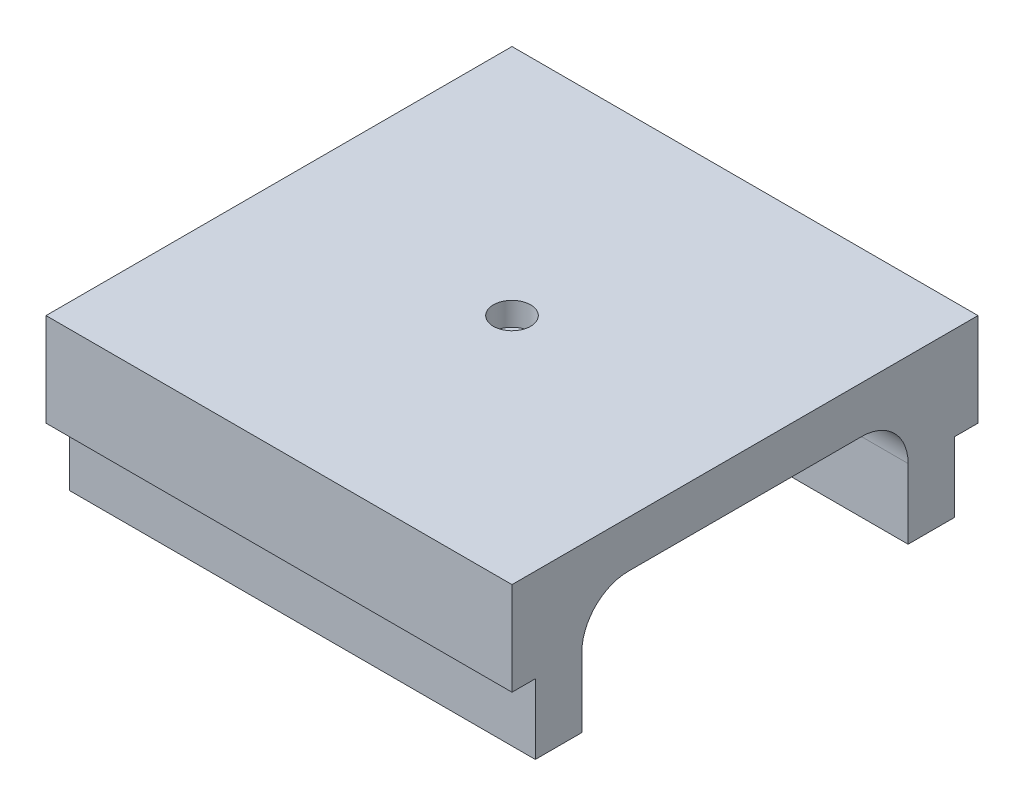
ISO-10303-21;
HEADER;
FILE_DESCRIPTION(('STEP AP214'),'2;1');
FILE_NAME('part.step','',(''),(''),'','','');
FILE_SCHEMA(('AUTOMOTIVE_DESIGN { 1 0 10303 214 1 1 1 1 }'));
ENDSEC;
DATA;
#1=APPLICATION_CONTEXT('core data for automotive mechanical design processes');
#2=APPLICATION_PROTOCOL_DEFINITION('international standard','automotive_design',2000,#1);
#3=PRODUCT_CONTEXT('',#1,'mechanical');
#4=PRODUCT('Part','Part','',(#3));
#5=PRODUCT_RELATED_PRODUCT_CATEGORY('part','',(#4));
#6=PRODUCT_DEFINITION_FORMATION('','',#4);
#7=PRODUCT_DEFINITION_CONTEXT('part definition',#1,'design');
#8=PRODUCT_DEFINITION('design','',#6,#7);
#9=PRODUCT_DEFINITION_SHAPE('','',#8);
#10=(LENGTH_UNIT() NAMED_UNIT(*) SI_UNIT(.MILLI.,.METRE.));
#11=(NAMED_UNIT(*) PLANE_ANGLE_UNIT() SI_UNIT($,.RADIAN.));
#12=(NAMED_UNIT(*) SI_UNIT($,.STERADIAN.) SOLID_ANGLE_UNIT());
#13=UNCERTAINTY_MEASURE_WITH_UNIT(LENGTH_MEASURE(1.E-05),#10,'distance_accuracy_value','');
#14=(GEOMETRIC_REPRESENTATION_CONTEXT(3) GLOBAL_UNCERTAINTY_ASSIGNED_CONTEXT((#13)) GLOBAL_UNIT_ASSIGNED_CONTEXT((#10,
#11,#12)) REPRESENTATION_CONTEXT('',''));
#15=CARTESIAN_POINT('',(0.,0.,0.));
#16=DIRECTION('',(0.,0.,1.));
#17=DIRECTION('',(1.,0.,0.));
#18=AXIS2_PLACEMENT_3D('',#15,#16,#17);
#19=CARTESIAN_POINT('',(0.,10.,0.));
#20=DIRECTION('',(0.,-1.,0.));
#21=DIRECTION('',(0.,0.,-1.));
#22=AXIS2_PLACEMENT_3D('',#19,#20,#21);
#23=PLANE('',#22);
#24=DIRECTION('',(1.,0.,0.));
#25=VECTOR('',#24,1.);
#26=CARTESIAN_POINT('',(0.,10.,-25.));
#27=LINE('',#26,#25);
#28=CARTESIAN_POINT('',(-50.,10.,-25.0000000000001));
#29=VERTEX_POINT('',#28);
#30=CARTESIAN_POINT('',(-35.,10.,-25.));
#31=VERTEX_POINT('',#30);
#32=EDGE_CURVE('E349',#29,#31,#27,.T.);
#33=ORIENTED_EDGE('',*,*,#32,.T.);
#34=DIRECTION('',(0.,0.,-1.));
#35=VECTOR('',#34,1.);
#36=CARTESIAN_POINT('',(-35.,10.,25.));
#37=LINE('',#36,#35);
#38=CARTESIAN_POINT('',(-35.,10.,25.));
#39=VERTEX_POINT('',#38);
#40=EDGE_CURVE('E417',#39,#31,#37,.T.);
#41=ORIENTED_EDGE('',*,*,#40,.F.);
#42=DIRECTION('',(-1.,0.,0.));
#43=VECTOR('',#42,1.);
#44=CARTESIAN_POINT('',(-50.,10.,25.));
#45=LINE('',#44,#43);
#46=CARTESIAN_POINT('',(-50.,10.,25.));
#47=VERTEX_POINT('',#46);
#48=EDGE_CURVE('E362',#39,#47,#45,.T.);
#49=ORIENTED_EDGE('',*,*,#48,.T.);
#50=DIRECTION('',(0.,0.,-1.));
#51=VECTOR('',#50,1.);
#52=CARTESIAN_POINT('',(-50.,10.,35.));
#53=LINE('',#52,#51);
#54=EDGE_CURVE('E216',#47,#29,#53,.T.);
#55=ORIENTED_EDGE('',*,*,#54,.T.);
#56=EDGE_LOOP('',(#33,#41,#49,#55));
#57=FACE_BOUND('',#56,.T.);
#58=ADVANCED_FACE('F62',(#57),#23,.T.);
#59=CARTESIAN_POINT('',(50.,10.,25.));
#60=VERTEX_POINT('',#59);
#61=CARTESIAN_POINT('',(-30.,10.,25.));
#62=VERTEX_POINT('',#61);
#63=EDGE_CURVE('E363',#60,#62,#45,.T.);
#64=ORIENTED_EDGE('',*,*,#63,.T.);
#65=DIRECTION('',(0.,0.,1.));
#66=VECTOR('',#65,1.);
#67=CARTESIAN_POINT('',(-30.,10.,-25.0000000000001));
#68=LINE('',#67,#66);
#69=CARTESIAN_POINT('',(-30.,10.,-25.));
#70=VERTEX_POINT('',#69);
#71=EDGE_CURVE('E78',#70,#62,#68,.T.);
#72=ORIENTED_EDGE('',*,*,#71,.F.);
#73=CARTESIAN_POINT('',(50.,10.,-25.));
#74=VERTEX_POINT('',#73);
#75=EDGE_CURVE('E348',#70,#74,#27,.T.);
#76=ORIENTED_EDGE('',*,*,#75,.T.);
#77=DIRECTION('',(0.,0.,1.));
#78=VECTOR('',#77,1.);
#79=CARTESIAN_POINT('',(50.,10.,-35.));
#80=LINE('',#79,#78);
#81=EDGE_CURVE('E220',#74,#60,#80,.T.);
#82=ORIENTED_EDGE('',*,*,#81,.T.);
#83=EDGE_LOOP('',(#64,#72,#76,#82));
#84=FACE_BOUND('',#83,.T.);
#85=ADVANCED_FACE('F386',(#84),#23,.T.);
#86=CARTESIAN_POINT('',(0.,0.,0.));
#87=DIRECTION('',(0.,1.,0.));
#88=DIRECTION('',(0.,0.,1.));
#89=AXIS2_PLACEMENT_3D('',#86,#87,#88);
#90=PLANE('',#89);
#91=DIRECTION('',(0.,0.,-1.));
#92=VECTOR('',#91,1.);
#93=CARTESIAN_POINT('',(-50.,0.,0.));
#94=LINE('',#93,#92);
#95=CARTESIAN_POINT('',(-50.,0.,50.));
#96=VERTEX_POINT('',#95);
#97=CARTESIAN_POINT('',(-50.,0.,45.));
#98=VERTEX_POINT('',#97);
#99=EDGE_CURVE('E319',#96,#98,#94,.T.);
#100=ORIENTED_EDGE('',*,*,#99,.T.);
#101=DIRECTION('',(1.,0.,0.));
#102=VECTOR('',#101,1.);
#103=CARTESIAN_POINT('',(0.,0.,45.));
#104=LINE('',#103,#102);
#105=CARTESIAN_POINT('',(50.,0.,45.));
#106=VERTEX_POINT('',#105);
#107=EDGE_CURVE('E235',#98,#106,#104,.T.);
#108=ORIENTED_EDGE('',*,*,#107,.T.);
#109=DIRECTION('',(0.,0.,-1.));
#110=VECTOR('',#109,1.);
#111=CARTESIAN_POINT('',(50.,0.,0.));
#112=LINE('',#111,#110);
#113=CARTESIAN_POINT('',(50.,0.,50.));
#114=VERTEX_POINT('',#113);
#115=EDGE_CURVE('E328',#114,#106,#112,.T.);
#116=ORIENTED_EDGE('',*,*,#115,.F.);
#117=DIRECTION('',(-1.,0.,0.));
#118=VECTOR('',#117,1.);
#119=CARTESIAN_POINT('',(0.,0.,50.));
#120=LINE('',#119,#118);
#121=EDGE_CURVE('E323',#114,#96,#120,.T.);
#122=ORIENTED_EDGE('',*,*,#121,.T.);
#123=EDGE_LOOP('',(#100,#108,#116,#122));
#124=FACE_BOUND('',#123,.T.);
#125=ADVANCED_FACE('F454',(#124),#90,.F.);
#126=CARTESIAN_POINT('',(0.,20.,50.));
#127=DIRECTION('',(0.,0.,1.));
#128=DIRECTION('',(1.,0.,0.));
#129=AXIS2_PLACEMENT_3D('',#126,#127,#128);
#130=PLANE('',#129);
#131=ORIENTED_EDGE('',*,*,#121,.F.);
#132=DIRECTION('',(0.,-1.,0.));
#133=VECTOR('',#132,1.);
#134=CARTESIAN_POINT('',(50.,20.,50.));
#135=LINE('',#134,#133);
#136=CARTESIAN_POINT('',(50.,20.,50.));
#137=VERTEX_POINT('',#136);
#138=EDGE_CURVE('E342',#137,#114,#135,.T.);
#139=ORIENTED_EDGE('',*,*,#138,.F.);
#140=DIRECTION('',(-1.,0.,0.));
#141=VECTOR('',#140,1.);
#142=CARTESIAN_POINT('',(0.,20.,50.));
#143=LINE('',#142,#141);
#144=CARTESIAN_POINT('',(-50.,20.,50.));
#145=VERTEX_POINT('',#144);
#146=EDGE_CURVE('E306',#137,#145,#143,.T.);
#147=ORIENTED_EDGE('',*,*,#146,.T.);
#148=DIRECTION('',(0.,-1.,0.));
#149=VECTOR('',#148,1.);
#150=CARTESIAN_POINT('',(-50.,20.,50.));
#151=LINE('',#150,#149);
#152=EDGE_CURVE('E345',#145,#96,#151,.T.);
#153=ORIENTED_EDGE('',*,*,#152,.T.);
#154=EDGE_LOOP('',(#131,#139,#147,#153));
#155=FACE_BOUND('',#154,.T.);
#156=ADVANCED_FACE('F492',(#155),#130,.T.);
#157=CARTESIAN_POINT('',(50.,20.,0.));
#158=DIRECTION('',(-1.,0.,0.));
#159=DIRECTION('',(0.,0.,1.));
#160=AXIS2_PLACEMENT_3D('',#157,#158,#159);
#161=PLANE('',#160);
#162=DIRECTION('',(0.,1.,0.));
#163=VECTOR('',#162,1.);
#164=CARTESIAN_POINT('',(50.,-15.,35.));
#165=LINE('',#164,#163);
#166=CARTESIAN_POINT('',(50.,-15.,35.));
#167=VERTEX_POINT('',#166);
#168=CARTESIAN_POINT('',(50.,0.,35.));
#169=VERTEX_POINT('',#168);
#170=EDGE_CURVE('E259',#167,#169,#165,.T.);
#171=ORIENTED_EDGE('',*,*,#170,.T.);
#172=CARTESIAN_POINT('',(50.,0.,25.));
#173=DIRECTION('',(-1.,0.,0.));
#174=DIRECTION('',(0.,0.,1.));
#175=AXIS2_PLACEMENT_3D('',#172,#173,#174);
#176=CIRCLE('',#175,10.);
#177=EDGE_CURVE('E12',#169,#60,#176,.T.);
#178=ORIENTED_EDGE('',*,*,#177,.T.);
#179=ORIENTED_EDGE('',*,*,#81,.F.);
#180=CARTESIAN_POINT('',(50.,0.,-25.));
#181=DIRECTION('',(-1.,0.,0.));
#182=DIRECTION('',(0.,0.,1.));
#183=AXIS2_PLACEMENT_3D('',#180,#181,#182);
#184=CIRCLE('',#183,10.);
#185=CARTESIAN_POINT('',(50.,0.,-35.));
#186=VERTEX_POINT('',#185);
#187=EDGE_CURVE('E355',#74,#186,#184,.T.);
#188=ORIENTED_EDGE('',*,*,#187,.T.);
#189=DIRECTION('',(0.,1.,0.));
#190=VECTOR('',#189,1.);
#191=CARTESIAN_POINT('',(50.,-15.,-35.));
#192=LINE('',#191,#190);
#193=CARTESIAN_POINT('',(50.,-15.,-35.));
#194=VERTEX_POINT('',#193);
#195=EDGE_CURVE('E287',#194,#186,#192,.T.);
#196=ORIENTED_EDGE('',*,*,#195,.F.);
#197=DIRECTION('',(0.,0.,1.));
#198=VECTOR('',#197,1.);
#199=CARTESIAN_POINT('',(50.,-15.,0.));
#200=LINE('',#199,#198);
#201=CARTESIAN_POINT('',(50.,-15.,-45.));
#202=VERTEX_POINT('',#201);
#203=EDGE_CURVE('E268',#202,#194,#200,.T.);
#204=ORIENTED_EDGE('',*,*,#203,.F.);
#205=DIRECTION('',(0.,1.,0.));
#206=VECTOR('',#205,1.);
#207=CARTESIAN_POINT('',(50.,-15.,-45.));
#208=LINE('',#207,#206);
#209=CARTESIAN_POINT('',(50.,0.,-45.));
#210=VERTEX_POINT('',#209);
#211=EDGE_CURVE('E249',#202,#210,#208,.T.);
#212=ORIENTED_EDGE('',*,*,#211,.T.);
#213=CARTESIAN_POINT('',(50.,0.,-50.));
#214=VERTEX_POINT('',#213);
#215=EDGE_CURVE('E327',#210,#214,#112,.T.);
#216=ORIENTED_EDGE('',*,*,#215,.T.);
#217=DIRECTION('',(0.,-1.,0.));
#218=VECTOR('',#217,1.);
#219=CARTESIAN_POINT('',(50.,20.,-50.));
#220=LINE('',#219,#218);
#221=CARTESIAN_POINT('',(50.,20.,-50.));
#222=VERTEX_POINT('',#221);
#223=EDGE_CURVE('E338',#222,#214,#220,.T.);
#224=ORIENTED_EDGE('',*,*,#223,.F.);
#225=DIRECTION('',(0.,0.,-1.));
#226=VECTOR('',#225,1.);
#227=CARTESIAN_POINT('',(50.,20.,0.));
#228=LINE('',#227,#226);
#229=EDGE_CURVE('E311',#137,#222,#228,.T.);
#230=ORIENTED_EDGE('',*,*,#229,.F.);
#231=ORIENTED_EDGE('',*,*,#138,.T.);
#232=ORIENTED_EDGE('',*,*,#115,.T.);
#233=DIRECTION('',(0.,1.,0.));
#234=VECTOR('',#233,1.);
#235=CARTESIAN_POINT('',(50.,-15.,45.));
#236=LINE('',#235,#234);
#237=CARTESIAN_POINT('',(50.,-15.,45.));
#238=VERTEX_POINT('',#237);
#239=EDGE_CURVE('E256',#238,#106,#236,.T.);
#240=ORIENTED_EDGE('',*,*,#239,.F.);
#241=DIRECTION('',(0.,0.,1.));
#242=VECTOR('',#241,1.);
#243=CARTESIAN_POINT('',(50.,-15.,0.));
#244=LINE('',#243,#242);
#245=EDGE_CURVE('E234',#167,#238,#244,.T.);
#246=ORIENTED_EDGE('',*,*,#245,.F.);
#247=EDGE_LOOP('',(#171,#178,#179,#188,#196,#204,#212,#216,#224,#230,#231,#232,#240,#246));
#248=FACE_BOUND('',#247,.T.);
#249=ADVANCED_FACE('F384',(#248),#161,.F.);
#250=CARTESIAN_POINT('',(0.,20.,-50.));
#251=DIRECTION('',(0.,0.,1.));
#252=DIRECTION('',(1.,0.,0.));
#253=AXIS2_PLACEMENT_3D('',#250,#251,#252);
#254=PLANE('',#253);
#255=DIRECTION('',(-1.,0.,0.));
#256=VECTOR('',#255,1.);
#257=CARTESIAN_POINT('',(0.,0.,-50.));
#258=LINE('',#257,#256);
#259=CARTESIAN_POINT('',(-50.,0.,-50.));
#260=VERTEX_POINT('',#259);
#261=EDGE_CURVE('E307',#214,#260,#258,.T.);
#262=ORIENTED_EDGE('',*,*,#261,.T.);
#263=DIRECTION('',(0.,-1.,0.));
#264=VECTOR('',#263,1.);
#265=CARTESIAN_POINT('',(-50.,20.,-50.));
#266=LINE('',#265,#264);
#267=CARTESIAN_POINT('',(-50.,20.,-50.));
#268=VERTEX_POINT('',#267);
#269=EDGE_CURVE('E318',#268,#260,#266,.T.);
#270=ORIENTED_EDGE('',*,*,#269,.F.);
#271=DIRECTION('',(-1.,0.,0.));
#272=VECTOR('',#271,1.);
#273=CARTESIAN_POINT('',(0.,20.,-50.));
#274=LINE('',#273,#272);
#275=EDGE_CURVE('E315',#222,#268,#274,.T.);
#276=ORIENTED_EDGE('',*,*,#275,.F.);
#277=ORIENTED_EDGE('',*,*,#223,.T.);
#278=EDGE_LOOP('',(#262,#270,#276,#277));
#279=FACE_BOUND('',#278,.T.);
#280=ADVANCED_FACE('F486',(#279),#254,.F.);
#281=CARTESIAN_POINT('',(-50.,20.,0.));
#282=DIRECTION('',(-1.,0.,0.));
#283=DIRECTION('',(0.,0.,1.));
#284=AXIS2_PLACEMENT_3D('',#281,#282,#283);
#285=PLANE('',#284);
#286=ORIENTED_EDGE('',*,*,#54,.F.);
#287=CARTESIAN_POINT('',(-50.,0.,25.));
#288=DIRECTION('',(-1.,0.,0.));
#289=DIRECTION('',(0.,0.,1.));
#290=AXIS2_PLACEMENT_3D('',#287,#288,#289);
#291=CIRCLE('',#290,10.);
#292=CARTESIAN_POINT('',(-50.,0.,35.));
#293=VERTEX_POINT('',#292);
#294=EDGE_CURVE('E71',#47,#293,#291,.F.);
#295=ORIENTED_EDGE('',*,*,#294,.T.);
#296=DIRECTION('',(0.,1.,0.));
#297=VECTOR('',#296,1.);
#298=CARTESIAN_POINT('',(-50.,-15.,35.));
#299=LINE('',#298,#297);
#300=CARTESIAN_POINT('',(-50.,-15.,35.));
#301=VERTEX_POINT('',#300);
#302=EDGE_CURVE('E245',#301,#293,#299,.T.);
#303=ORIENTED_EDGE('',*,*,#302,.F.);
#304=DIRECTION('',(0.,0.,-1.));
#305=VECTOR('',#304,1.);
#306=CARTESIAN_POINT('',(-50.,-15.,0.));
#307=LINE('',#306,#305);
#308=CARTESIAN_POINT('',(-50.,-15.,45.));
#309=VERTEX_POINT('',#308);
#310=EDGE_CURVE('E242',#309,#301,#307,.T.);
#311=ORIENTED_EDGE('',*,*,#310,.F.);
#312=DIRECTION('',(0.,1.,0.));
#313=VECTOR('',#312,1.);
#314=CARTESIAN_POINT('',(-50.,-15.,45.));
#315=LINE('',#314,#313);
#316=EDGE_CURVE('E253',#309,#98,#315,.T.);
#317=ORIENTED_EDGE('',*,*,#316,.T.);
#318=ORIENTED_EDGE('',*,*,#99,.F.);
#319=ORIENTED_EDGE('',*,*,#152,.F.);
#320=DIRECTION('',(0.,0.,-1.));
#321=VECTOR('',#320,1.);
#322=CARTESIAN_POINT('',(-50.,20.,0.));
#323=LINE('',#322,#321);
#324=EDGE_CURVE('E302',#145,#268,#323,.T.);
#325=ORIENTED_EDGE('',*,*,#324,.T.);
#326=ORIENTED_EDGE('',*,*,#269,.T.);
#327=CARTESIAN_POINT('',(-50.,0.,-45.));
#328=VERTEX_POINT('',#327);
#329=EDGE_CURVE('E298',#328,#260,#94,.T.);
#330=ORIENTED_EDGE('',*,*,#329,.F.);
#331=DIRECTION('',(0.,1.,0.));
#332=VECTOR('',#331,1.);
#333=CARTESIAN_POINT('',(-50.,-15.,-45.));
#334=LINE('',#333,#332);
#335=CARTESIAN_POINT('',(-50.,-15.,-45.));
#336=VERTEX_POINT('',#335);
#337=EDGE_CURVE('E277',#336,#328,#334,.T.);
#338=ORIENTED_EDGE('',*,*,#337,.F.);
#339=DIRECTION('',(0.,0.,-1.));
#340=VECTOR('',#339,1.);
#341=CARTESIAN_POINT('',(-50.,-15.,0.));
#342=LINE('',#341,#340);
#343=CARTESIAN_POINT('',(-50.,-15.,-35.0000000000001));
#344=VERTEX_POINT('',#343);
#345=EDGE_CURVE('E274',#344,#336,#342,.T.);
#346=ORIENTED_EDGE('',*,*,#345,.F.);
#347=DIRECTION('',(0.,1.,0.));
#348=VECTOR('',#347,1.);
#349=CARTESIAN_POINT('',(-50.,-15.,-35.0000000000001));
#350=LINE('',#349,#348);
#351=CARTESIAN_POINT('',(-50.,0.,-35.0000000000001));
#352=VERTEX_POINT('',#351);
#353=EDGE_CURVE('E283',#344,#352,#350,.T.);
#354=ORIENTED_EDGE('',*,*,#353,.T.);
#355=CARTESIAN_POINT('',(-50.,0.,-25.0000000000001));
#356=DIRECTION('',(-1.,0.,0.));
#357=DIRECTION('',(0.,0.,1.));
#358=AXIS2_PLACEMENT_3D('',#355,#356,#357);
#359=CIRCLE('',#358,10.);
#360=EDGE_CURVE('E358',#352,#29,#359,.F.);
#361=ORIENTED_EDGE('',*,*,#360,.T.);
#362=EDGE_LOOP('',(#286,#295,#303,#311,#317,#318,#319,#325,#326,#330,#338,#346,#354,#361));
#363=FACE_BOUND('',#362,.T.);
#364=ADVANCED_FACE('F373',(#363),#285,.T.);
#365=ORIENTED_EDGE('',*,*,#215,.F.);
#366=DIRECTION('',(-1.,0.,0.));
#367=VECTOR('',#366,1.);
#368=CARTESIAN_POINT('',(0.,0.,-45.));
#369=LINE('',#368,#367);
#370=EDGE_CURVE('E229',#210,#328,#369,.T.);
#371=ORIENTED_EDGE('',*,*,#370,.T.);
#372=ORIENTED_EDGE('',*,*,#329,.T.);
#373=ORIENTED_EDGE('',*,*,#261,.F.);
#374=EDGE_LOOP('',(#365,#371,#372,#373));
#375=FACE_BOUND('',#374,.T.);
#376=ADVANCED_FACE('F410',(#375),#90,.F.);
#377=CARTESIAN_POINT('',(0.,20.,0.));
#378=DIRECTION('',(0.,1.,0.));
#379=DIRECTION('',(0.,0.,1.));
#380=AXIS2_PLACEMENT_3D('',#377,#378,#379);
#381=PLANE('',#380);
#382=CARTESIAN_POINT('',(0.,20.,0.));
#383=DIRECTION('',(0.,1.,0.));
#384=DIRECTION('',(0.,0.,1.));
#385=AXIS2_PLACEMENT_3D('',#382,#383,#384);
#386=CIRCLE('',#385,4.);
#387=CARTESIAN_POINT('',(0.,20.,4.));
#388=VERTEX_POINT('',#387);
#389=EDGE_CURVE('E263',#388,#388,#386,.T.);
#390=ORIENTED_EDGE('',*,*,#389,.F.);
#391=EDGE_LOOP('',(#390));
#392=FACE_BOUND('',#391,.T.);
#393=ORIENTED_EDGE('',*,*,#324,.F.);
#394=ORIENTED_EDGE('',*,*,#146,.F.);
#395=ORIENTED_EDGE('',*,*,#229,.T.);
#396=ORIENTED_EDGE('',*,*,#275,.T.);
#397=EDGE_LOOP('',(#393,#394,#395,#396));
#398=FACE_BOUND('',#397,.T.);
#399=ADVANCED_FACE('F479',(#392,#398),#381,.T.);
#400=CARTESIAN_POINT('',(0.,15.,0.));
#401=DIRECTION('',(0.,1.,0.));
#402=DIRECTION('',(0.,0.,1.));
#403=AXIS2_PLACEMENT_3D('',#400,#401,#402);
#404=CYLINDRICAL_SURFACE('',#403,4.);
#405=CARTESIAN_POINT('',(0.,15.,0.));
#406=DIRECTION('',(0.,1.,0.));
#407=DIRECTION('',(0.,0.,1.));
#408=AXIS2_PLACEMENT_3D('',#405,#406,#407);
#409=CIRCLE('',#408,4.);
#410=CARTESIAN_POINT('',(0.,15.,4.));
#411=VERTEX_POINT('',#410);
#412=EDGE_CURVE('E294',#411,#411,#409,.T.);
#413=ORIENTED_EDGE('',*,*,#412,.F.);
#414=EDGE_LOOP('',(#413));
#415=FACE_BOUND('',#414,.T.);
#416=ORIENTED_EDGE('',*,*,#389,.T.);
#417=EDGE_LOOP('',(#416));
#418=FACE_BOUND('',#417,.T.);
#419=ADVANCED_FACE('F475',(#415,#418),#404,.F.);
#420=CARTESIAN_POINT('',(0.,15.,0.));
#421=DIRECTION('',(0.,1.,0.));
#422=DIRECTION('',(0.,0.,1.));
#423=AXIS2_PLACEMENT_3D('',#420,#421,#422);
#424=PLANE('',#423);
#425=ORIENTED_EDGE('',*,*,#412,.T.);
#426=EDGE_LOOP('',(#425));
#427=FACE_BOUND('',#426,.T.);
#428=ADVANCED_FACE('F472',(#427),#424,.T.);
#429=CARTESIAN_POINT('',(0.,-15.,-45.));
#430=DIRECTION('',(0.,0.,-1.));
#431=DIRECTION('',(-1.,0.,0.));
#432=AXIS2_PLACEMENT_3D('',#429,#430,#431);
#433=PLANE('',#432);
#434=ORIENTED_EDGE('',*,*,#370,.F.);
#435=ORIENTED_EDGE('',*,*,#211,.F.);
#436=DIRECTION('',(-1.,0.,0.));
#437=VECTOR('',#436,1.);
#438=CARTESIAN_POINT('',(0.,-15.,-45.));
#439=LINE('',#438,#437);
#440=EDGE_CURVE('E264',#202,#336,#439,.T.);
#441=ORIENTED_EDGE('',*,*,#440,.T.);
#442=ORIENTED_EDGE('',*,*,#337,.T.);
#443=EDGE_LOOP('',(#434,#435,#441,#442));
#444=FACE_BOUND('',#443,.T.);
#445=ADVANCED_FACE('F407',(#444),#433,.T.);
#446=CARTESIAN_POINT('',(0.,-15.,-35.));
#447=DIRECTION('',(0.,0.,-1.));
#448=DIRECTION('',(-1.,0.,0.));
#449=AXIS2_PLACEMENT_3D('',#446,#447,#448);
#450=PLANE('',#449);
#451=ORIENTED_EDGE('',*,*,#195,.T.);
#452=DIRECTION('',(1.,0.,0.));
#453=VECTOR('',#452,1.);
#454=CARTESIAN_POINT('',(0.,0.,-35.));
#455=LINE('',#454,#453);
#456=EDGE_CURVE('E352',#186,#352,#455,.F.);
#457=ORIENTED_EDGE('',*,*,#456,.T.);
#458=ORIENTED_EDGE('',*,*,#353,.F.);
#459=DIRECTION('',(-1.,0.,0.));
#460=VECTOR('',#459,1.);
#461=CARTESIAN_POINT('',(0.,-15.,-35.));
#462=LINE('',#461,#460);
#463=EDGE_CURVE('E271',#194,#344,#462,.T.);
#464=ORIENTED_EDGE('',*,*,#463,.F.);
#465=EDGE_LOOP('',(#451,#457,#458,#464));
#466=FACE_BOUND('',#465,.T.);
#467=ADVANCED_FACE('F396',(#466),#450,.F.);
#468=CARTESIAN_POINT('',(0.,-15.,0.));
#469=DIRECTION('',(0.,-1.,0.));
#470=DIRECTION('',(0.,0.,-1.));
#471=AXIS2_PLACEMENT_3D('',#468,#469,#470);
#472=PLANE('',#471);
#473=ORIENTED_EDGE('',*,*,#440,.F.);
#474=ORIENTED_EDGE('',*,*,#203,.T.);
#475=ORIENTED_EDGE('',*,*,#463,.T.);
#476=ORIENTED_EDGE('',*,*,#345,.T.);
#477=EDGE_LOOP('',(#473,#474,#475,#476));
#478=FACE_BOUND('',#477,.T.);
#479=ADVANCED_FACE('F401',(#478),#472,.T.);
#480=CARTESIAN_POINT('',(0.,-15.,35.));
#481=DIRECTION('',(0.,0.,-1.));
#482=DIRECTION('',(-1.,0.,0.));
#483=AXIS2_PLACEMENT_3D('',#480,#481,#482);
#484=PLANE('',#483);
#485=ORIENTED_EDGE('',*,*,#302,.T.);
#486=DIRECTION('',(-1.,0.,0.));
#487=VECTOR('',#486,1.);
#488=CARTESIAN_POINT('',(50.,0.,35.));
#489=LINE('',#488,#487);
#490=EDGE_CURVE('E366',#293,#169,#489,.F.);
#491=ORIENTED_EDGE('',*,*,#490,.T.);
#492=ORIENTED_EDGE('',*,*,#170,.F.);
#493=DIRECTION('',(-1.,0.,0.));
#494=VECTOR('',#493,1.);
#495=CARTESIAN_POINT('',(0.,-15.,35.));
#496=LINE('',#495,#494);
#497=EDGE_CURVE('E230',#167,#301,#496,.T.);
#498=ORIENTED_EDGE('',*,*,#497,.T.);
#499=EDGE_LOOP('',(#485,#491,#492,#498));
#500=FACE_BOUND('',#499,.T.);
#501=ADVANCED_FACE('F378',(#500),#484,.T.);
#502=CARTESIAN_POINT('',(0.,-15.,45.));
#503=DIRECTION('',(0.,0.,1.));
#504=DIRECTION('',(1.,0.,0.));
#505=AXIS2_PLACEMENT_3D('',#502,#503,#504);
#506=PLANE('',#505);
#507=ORIENTED_EDGE('',*,*,#107,.F.);
#508=ORIENTED_EDGE('',*,*,#316,.F.);
#509=DIRECTION('',(1.,0.,0.));
#510=VECTOR('',#509,1.);
#511=CARTESIAN_POINT('',(0.,-15.,45.));
#512=LINE('',#511,#510);
#513=EDGE_CURVE('E238',#309,#238,#512,.T.);
#514=ORIENTED_EDGE('',*,*,#513,.T.);
#515=ORIENTED_EDGE('',*,*,#239,.T.);
#516=EDGE_LOOP('',(#507,#508,#514,#515));
#517=FACE_BOUND('',#516,.T.);
#518=ADVANCED_FACE('F460',(#517),#506,.T.);
#519=CARTESIAN_POINT('',(0.,-15.,0.));
#520=DIRECTION('',(0.,-1.,0.));
#521=DIRECTION('',(0.,0.,-1.));
#522=AXIS2_PLACEMENT_3D('',#519,#520,#521);
#523=PLANE('',#522);
#524=ORIENTED_EDGE('',*,*,#497,.F.);
#525=ORIENTED_EDGE('',*,*,#245,.T.);
#526=ORIENTED_EDGE('',*,*,#513,.F.);
#527=ORIENTED_EDGE('',*,*,#310,.T.);
#528=EDGE_LOOP('',(#524,#525,#526,#527));
#529=FACE_BOUND('',#528,.T.);
#530=ADVANCED_FACE('F457',(#529),#523,.T.);
#531=CARTESIAN_POINT('',(0.,0.,-25.));
#532=DIRECTION('',(1.,0.,0.));
#533=DIRECTION('',(0.,0.,-1.));
#534=AXIS2_PLACEMENT_3D('',#531,#532,#533);
#535=CYLINDRICAL_SURFACE('',#534,10.);
#536=ORIENTED_EDGE('',*,*,#360,.F.);
#537=ORIENTED_EDGE('',*,*,#456,.F.);
#538=ORIENTED_EDGE('',*,*,#187,.F.);
#539=ORIENTED_EDGE('',*,*,#75,.F.);
#540=DIRECTION('',(1.,0.,0.));
#541=VECTOR('',#540,1.);
#542=CARTESIAN_POINT('',(-35.,10.,-25.0000000000001));
#543=LINE('',#542,#541);
#544=EDGE_CURVE('E85',#31,#70,#543,.T.);
#545=ORIENTED_EDGE('',*,*,#544,.F.);
#546=ORIENTED_EDGE('',*,*,#32,.F.);
#547=EDGE_LOOP('',(#536,#537,#538,#539,#545,#546));
#548=FACE_BOUND('',#547,.T.);
#549=ADVANCED_FACE('F391',(#548),#535,.F.);
#550=CARTESIAN_POINT('',(0.,0.,25.));
#551=DIRECTION('',(1.,0.,0.));
#552=DIRECTION('',(0.,0.,-1.));
#553=AXIS2_PLACEMENT_3D('',#550,#551,#552);
#554=CYLINDRICAL_SURFACE('',#553,10.);
#555=ORIENTED_EDGE('',*,*,#177,.F.);
#556=ORIENTED_EDGE('',*,*,#490,.F.);
#557=ORIENTED_EDGE('',*,*,#294,.F.);
#558=ORIENTED_EDGE('',*,*,#48,.F.);
#559=DIRECTION('',(-1.,0.,0.));
#560=VECTOR('',#559,1.);
#561=CARTESIAN_POINT('',(-30.,10.,25.));
#562=LINE('',#561,#560);
#563=EDGE_CURVE('E214',#62,#39,#562,.T.);
#564=ORIENTED_EDGE('',*,*,#563,.F.);
#565=ORIENTED_EDGE('',*,*,#63,.F.);
#566=EDGE_LOOP('',(#555,#556,#557,#558,#564,#565));
#567=FACE_BOUND('',#566,.T.);
#568=ADVANCED_FACE('F64',(#567),#554,.F.);
#569=CARTESIAN_POINT('',(-30.,2.,25.));
#570=DIRECTION('',(0.,0.,-1.));
#571=DIRECTION('',(-1.,0.,0.));
#572=AXIS2_PLACEMENT_3D('',#569,#570,#571);
#573=PLANE('',#572);
#574=ORIENTED_EDGE('',*,*,#563,.T.);
#575=DIRECTION('',(0.,1.,0.));
#576=VECTOR('',#575,1.);
#577=CARTESIAN_POINT('',(-35.,2.,25.));
#578=LINE('',#577,#576);
#579=CARTESIAN_POINT('',(-35.,2.,25.));
#580=VERTEX_POINT('',#579);
#581=EDGE_CURVE('E194',#580,#39,#578,.T.);
#582=ORIENTED_EDGE('',*,*,#581,.F.);
#583=DIRECTION('',(-1.,0.,0.));
#584=VECTOR('',#583,1.);
#585=CARTESIAN_POINT('',(-30.,2.,25.));
#586=LINE('',#585,#584);
#587=CARTESIAN_POINT('',(-30.,2.,25.));
#588=VERTEX_POINT('',#587);
#589=EDGE_CURVE('E202',#588,#580,#586,.T.);
#590=ORIENTED_EDGE('',*,*,#589,.F.);
#591=DIRECTION('',(0.,1.,0.));
#592=VECTOR('',#591,1.);
#593=CARTESIAN_POINT('',(-30.,2.,25.));
#594=LINE('',#593,#592);
#595=EDGE_CURVE('E429',#588,#62,#594,.T.);
#596=ORIENTED_EDGE('',*,*,#595,.T.);
#597=EDGE_LOOP('',(#574,#582,#590,#596));
#598=FACE_BOUND('',#597,.T.);
#599=ADVANCED_FACE('F213',(#598),#573,.F.);
#600=CARTESIAN_POINT('',(-35.,2.,25.));
#601=DIRECTION('',(1.,0.,0.));
#602=DIRECTION('',(0.,0.,-1.));
#603=AXIS2_PLACEMENT_3D('',#600,#601,#602);
#604=PLANE('',#603);
#605=ORIENTED_EDGE('',*,*,#40,.T.);
#606=DIRECTION('',(0.,1.,0.));
#607=VECTOR('',#606,1.);
#608=CARTESIAN_POINT('',(-35.,2.,-25.0000000000001));
#609=LINE('',#608,#607);
#610=CARTESIAN_POINT('',(-35.,2.,-25.0000000000001));
#611=VERTEX_POINT('',#610);
#612=EDGE_CURVE('E197',#611,#31,#609,.T.);
#613=ORIENTED_EDGE('',*,*,#612,.F.);
#614=DIRECTION('',(0.,0.,-1.));
#615=VECTOR('',#614,1.);
#616=CARTESIAN_POINT('',(-35.,2.,25.));
#617=LINE('',#616,#615);
#618=EDGE_CURVE('E189',#580,#611,#617,.T.);
#619=ORIENTED_EDGE('',*,*,#618,.F.);
#620=ORIENTED_EDGE('',*,*,#581,.T.);
#621=EDGE_LOOP('',(#605,#613,#619,#620));
#622=FACE_BOUND('',#621,.T.);
#623=ADVANCED_FACE('F192',(#622),#604,.F.);
#624=CARTESIAN_POINT('',(-35.,2.,-25.0000000000001));
#625=DIRECTION('',(0.,0.,1.));
#626=DIRECTION('',(1.,0.,0.));
#627=AXIS2_PLACEMENT_3D('',#624,#625,#626);
#628=PLANE('',#627);
#629=ORIENTED_EDGE('',*,*,#544,.T.);
#630=DIRECTION('',(0.,1.,0.));
#631=VECTOR('',#630,1.);
#632=CARTESIAN_POINT('',(-30.,2.,-25.0000000000001));
#633=LINE('',#632,#631);
#634=CARTESIAN_POINT('',(-30.,2.,-25.0000000000001));
#635=VERTEX_POINT('',#634);
#636=EDGE_CURVE('E222',#635,#70,#633,.T.);
#637=ORIENTED_EDGE('',*,*,#636,.F.);
#638=DIRECTION('',(1.,0.,0.));
#639=VECTOR('',#638,1.);
#640=CARTESIAN_POINT('',(-35.,2.,-25.0000000000001));
#641=LINE('',#640,#639);
#642=EDGE_CURVE('E201',#611,#635,#641,.T.);
#643=ORIENTED_EDGE('',*,*,#642,.F.);
#644=ORIENTED_EDGE('',*,*,#612,.T.);
#645=EDGE_LOOP('',(#629,#637,#643,#644));
#646=FACE_BOUND('',#645,.T.);
#647=ADVANCED_FACE('F437',(#646),#628,.F.);
#648=CARTESIAN_POINT('',(-30.,2.,-25.0000000000001));
#649=DIRECTION('',(-1.,0.,0.));
#650=DIRECTION('',(0.,0.,1.));
#651=AXIS2_PLACEMENT_3D('',#648,#649,#650);
#652=PLANE('',#651);
#653=ORIENTED_EDGE('',*,*,#71,.T.);
#654=ORIENTED_EDGE('',*,*,#595,.F.);
#655=DIRECTION('',(0.,0.,1.));
#656=VECTOR('',#655,1.);
#657=CARTESIAN_POINT('',(-30.,2.,-25.0000000000001));
#658=LINE('',#657,#656);
#659=EDGE_CURVE('E207',#635,#588,#658,.T.);
#660=ORIENTED_EDGE('',*,*,#659,.F.);
#661=ORIENTED_EDGE('',*,*,#636,.T.);
#662=EDGE_LOOP('',(#653,#654,#660,#661));
#663=FACE_BOUND('',#662,.T.);
#664=ADVANCED_FACE('F435',(#663),#652,.F.);
#665=CARTESIAN_POINT('',(0.,2.,0.));
#666=DIRECTION('',(0.,-1.,0.));
#667=DIRECTION('',(0.,0.,-1.));
#668=AXIS2_PLACEMENT_3D('',#665,#666,#667);
#669=PLANE('',#668);
#670=ORIENTED_EDGE('',*,*,#589,.T.);
#671=ORIENTED_EDGE('',*,*,#618,.T.);
#672=ORIENTED_EDGE('',*,*,#642,.T.);
#673=ORIENTED_EDGE('',*,*,#659,.T.);
#674=EDGE_LOOP('',(#670,#671,#672,#673));
#675=FACE_BOUND('',#674,.T.);
#676=ADVANCED_FACE('F205',(#675),#669,.T.);
#677=CLOSED_SHELL('',(#58,#85,#125,#156,#249,#280,#364,#376,#399,#419,#428,#445,#467,#479,#501,
#518,#530,#549,#568,#599,#623,#647,#664,#676));
#678=MANIFOLD_SOLID_BREP('B2',#677);
#679=ADVANCED_BREP_SHAPE_REPRESENTATION('',(#18,#678),#14);
#680=SHAPE_DEFINITION_REPRESENTATION(#9,#679);
ENDSEC;
END-ISO-10303-21;
